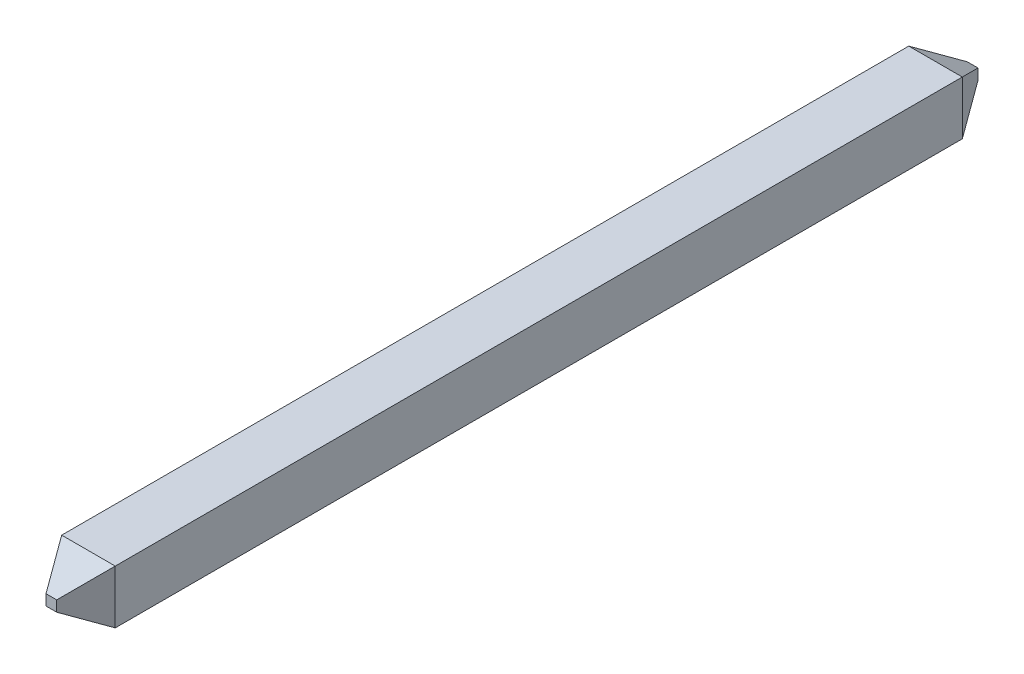
ISO-10303-21;
HEADER;
FILE_DESCRIPTION(('STEP AP214'),'2;1');
FILE_NAME('part.step','',(''),(''),'','','');
FILE_SCHEMA(('AUTOMOTIVE_DESIGN { 1 0 10303 214 1 1 1 1 }'));
ENDSEC;
DATA;
#1=APPLICATION_CONTEXT('core data for automotive mechanical design processes');
#2=APPLICATION_PROTOCOL_DEFINITION('international standard','automotive_design',2000,#1);
#3=PRODUCT_CONTEXT('',#1,'mechanical');
#4=PRODUCT('Part','Part','',(#3));
#5=PRODUCT_RELATED_PRODUCT_CATEGORY('part','',(#4));
#6=PRODUCT_DEFINITION_FORMATION('','',#4);
#7=PRODUCT_DEFINITION_CONTEXT('part definition',#1,'design');
#8=PRODUCT_DEFINITION('design','',#6,#7);
#9=PRODUCT_DEFINITION_SHAPE('','',#8);
#10=(LENGTH_UNIT() NAMED_UNIT(*) SI_UNIT(.MILLI.,.METRE.));
#11=(NAMED_UNIT(*) PLANE_ANGLE_UNIT() SI_UNIT($,.RADIAN.));
#12=(NAMED_UNIT(*) SI_UNIT($,.STERADIAN.) SOLID_ANGLE_UNIT());
#13=UNCERTAINTY_MEASURE_WITH_UNIT(LENGTH_MEASURE(1.E-05),#10,'distance_accuracy_value','');
#14=(GEOMETRIC_REPRESENTATION_CONTEXT(3) GLOBAL_UNCERTAINTY_ASSIGNED_CONTEXT((#13)) GLOBAL_UNIT_ASSIGNED_CONTEXT((#10,
#11,#12)) REPRESENTATION_CONTEXT('',''));
#15=CARTESIAN_POINT('',(0.,0.,0.));
#16=DIRECTION('',(0.,0.,1.));
#17=DIRECTION('',(1.,0.,0.));
#18=AXIS2_PLACEMENT_3D('',#15,#16,#17);
#19=CARTESIAN_POINT('',(0.3175,-0.3175,10.922));
#20=DIRECTION('',(-1.,0.,0.));
#21=DIRECTION('',(0.,0.,1.));
#22=AXIS2_PLACEMENT_3D('',#19,#20,#21);
#23=PLANE('',#22);
#24=DIRECTION('',(0.,0.,-1.));
#25=VECTOR('',#24,1.);
#26=CARTESIAN_POINT('',(0.3175,-0.3175,10.922));
#27=LINE('',#26,#25);
#28=CARTESIAN_POINT('',(0.3175,-0.3175,10.4820590948775));
#29=VERTEX_POINT('',#28);
#30=CARTESIAN_POINT('',(0.3175,-0.3175,0.439940905122496));
#31=VERTEX_POINT('',#30);
#32=EDGE_CURVE('E142',#29,#31,#27,.T.);
#33=ORIENTED_EDGE('',*,*,#32,.T.);
#34=DIRECTION('',(0.,1.,0.));
#35=VECTOR('',#34,1.);
#36=CARTESIAN_POINT('',(0.3175,0.3175,0.439940905122496));
#37=LINE('',#36,#35);
#38=CARTESIAN_POINT('',(0.3175,0.3175,0.439940905122496));
#39=VERTEX_POINT('',#38);
#40=EDGE_CURVE('E11',#31,#39,#37,.T.);
#41=ORIENTED_EDGE('',*,*,#40,.T.);
#42=DIRECTION('',(0.,0.,-1.));
#43=VECTOR('',#42,1.);
#44=CARTESIAN_POINT('',(0.3175,0.3175,10.922));
#45=LINE('',#44,#43);
#46=CARTESIAN_POINT('',(0.3175,0.3175,10.4820590948775));
#47=VERTEX_POINT('',#46);
#48=EDGE_CURVE('E119',#47,#39,#45,.T.);
#49=ORIENTED_EDGE('',*,*,#48,.F.);
#50=DIRECTION('',(0.,-1.,0.));
#51=VECTOR('',#50,1.);
#52=CARTESIAN_POINT('',(0.3175,-0.3175,10.4820590948775));
#53=LINE('',#52,#51);
#54=EDGE_CURVE('E132',#47,#29,#53,.T.);
#55=ORIENTED_EDGE('',*,*,#54,.T.);
#56=EDGE_LOOP('',(#33,#41,#49,#55));
#57=FACE_BOUND('',#56,.T.);
#58=ADVANCED_FACE('F32',(#57),#23,.F.);
#59=CARTESIAN_POINT('',(-0.3175,0.3175,10.922));
#60=DIRECTION('',(0.,-1.,0.));
#61=DIRECTION('',(0.,0.,-1.));
#62=AXIS2_PLACEMENT_3D('',#59,#60,#61);
#63=PLANE('',#62);
#64=ORIENTED_EDGE('',*,*,#48,.T.);
#65=DIRECTION('',(-1.,0.,0.));
#66=VECTOR('',#65,1.);
#67=CARTESIAN_POINT('',(-0.3175,0.3175,0.439940905122496));
#68=LINE('',#67,#66);
#69=CARTESIAN_POINT('',(-0.3175,0.3175,0.439940905122496));
#70=VERTEX_POINT('',#69);
#71=EDGE_CURVE('E41',#39,#70,#68,.T.);
#72=ORIENTED_EDGE('',*,*,#71,.T.);
#73=DIRECTION('',(0.,0.,-1.));
#74=VECTOR('',#73,1.);
#75=CARTESIAN_POINT('',(-0.3175,0.3175,10.922));
#76=LINE('',#75,#74);
#77=CARTESIAN_POINT('',(-0.3175,0.3175,10.4820590948775));
#78=VERTEX_POINT('',#77);
#79=EDGE_CURVE('E190',#78,#70,#76,.T.);
#80=ORIENTED_EDGE('',*,*,#79,.F.);
#81=DIRECTION('',(1.,0.,0.));
#82=VECTOR('',#81,1.);
#83=CARTESIAN_POINT('',(-0.3175,0.3175,10.4820590948775));
#84=LINE('',#83,#82);
#85=EDGE_CURVE('E126',#78,#47,#84,.T.);
#86=ORIENTED_EDGE('',*,*,#85,.T.);
#87=EDGE_LOOP('',(#64,#72,#80,#86));
#88=FACE_BOUND('',#87,.T.);
#89=ADVANCED_FACE('F202',(#88),#63,.F.);
#90=CARTESIAN_POINT('',(-0.3175,-0.3175,10.922));
#91=DIRECTION('',(1.,0.,0.));
#92=DIRECTION('',(0.,0.,-1.));
#93=AXIS2_PLACEMENT_3D('',#90,#91,#92);
#94=PLANE('',#93);
#95=ORIENTED_EDGE('',*,*,#79,.T.);
#96=DIRECTION('',(0.,-1.,0.));
#97=VECTOR('',#96,1.);
#98=CARTESIAN_POINT('',(-0.3175,-0.3175,0.439940905122496));
#99=LINE('',#98,#97);
#100=CARTESIAN_POINT('',(-0.3175,-0.3175,0.439940905122496));
#101=VERTEX_POINT('',#100);
#102=EDGE_CURVE('E154',#70,#101,#99,.T.);
#103=ORIENTED_EDGE('',*,*,#102,.T.);
#104=DIRECTION('',(0.,0.,-1.));
#105=VECTOR('',#104,1.);
#106=CARTESIAN_POINT('',(-0.3175,-0.3175,10.922));
#107=LINE('',#106,#105);
#108=CARTESIAN_POINT('',(-0.3175,-0.3175,10.4820590948775));
#109=VERTEX_POINT('',#108);
#110=EDGE_CURVE('E187',#109,#101,#107,.T.);
#111=ORIENTED_EDGE('',*,*,#110,.F.);
#112=DIRECTION('',(0.,1.,0.));
#113=VECTOR('',#112,1.);
#114=CARTESIAN_POINT('',(-0.3175,-0.3175,10.4820590948775));
#115=LINE('',#114,#113);
#116=EDGE_CURVE('E106',#109,#78,#115,.T.);
#117=ORIENTED_EDGE('',*,*,#116,.T.);
#118=EDGE_LOOP('',(#95,#103,#111,#117));
#119=FACE_BOUND('',#118,.T.);
#120=ADVANCED_FACE('F201',(#119),#94,.F.);
#121=CARTESIAN_POINT('',(-0.3175,-0.3175,10.922));
#122=DIRECTION('',(0.,1.,0.));
#123=DIRECTION('',(0.,0.,1.));
#124=AXIS2_PLACEMENT_3D('',#121,#122,#123);
#125=PLANE('',#124);
#126=ORIENTED_EDGE('',*,*,#110,.T.);
#127=DIRECTION('',(1.,0.,0.));
#128=VECTOR('',#127,1.);
#129=CARTESIAN_POINT('',(0.3175,-0.3175,0.439940905122496));
#130=LINE('',#129,#128);
#131=EDGE_CURVE('E135',#101,#31,#130,.T.);
#132=ORIENTED_EDGE('',*,*,#131,.T.);
#133=ORIENTED_EDGE('',*,*,#32,.F.);
#134=DIRECTION('',(-1.,0.,0.));
#135=VECTOR('',#134,1.);
#136=CARTESIAN_POINT('',(-0.3175,-0.3175,10.4820590948775));
#137=LINE('',#136,#135);
#138=EDGE_CURVE('E134',#29,#109,#137,.T.);
#139=ORIENTED_EDGE('',*,*,#138,.T.);
#140=EDGE_LOOP('',(#126,#132,#133,#139));
#141=FACE_BOUND('',#140,.T.);
#142=ADVANCED_FACE('F185',(#141),#125,.F.);
#143=CARTESIAN_POINT('',(0.,0.,10.922));
#144=DIRECTION('',(0.,0.,-1.));
#145=DIRECTION('',(-1.,0.,0.));
#146=AXIS2_PLACEMENT_3D('',#143,#144,#145);
#147=PLANE('',#146);
#148=DIRECTION('',(-1.,0.,0.));
#149=VECTOR('',#148,1.);
#150=CARTESIAN_POINT('',(0.,0.0634999999999993,10.922));
#151=LINE('',#150,#149);
#152=CARTESIAN_POINT('',(0.0634999999999993,0.0634999999999993,10.922));
#153=VERTEX_POINT('',#152);
#154=CARTESIAN_POINT('',(-0.0634999999999993,0.0634999999999993,10.922));
#155=VERTEX_POINT('',#154);
#156=EDGE_CURVE('E123',#153,#155,#151,.T.);
#157=ORIENTED_EDGE('',*,*,#156,.T.);
#158=DIRECTION('',(0.,-1.,0.));
#159=VECTOR('',#158,1.);
#160=CARTESIAN_POINT('',(-0.0634999999999993,0.,10.922));
#161=LINE('',#160,#159);
#162=CARTESIAN_POINT('',(-0.0634999999999993,-0.0634999999999993,10.922));
#163=VERTEX_POINT('',#162);
#164=EDGE_CURVE('E104',#155,#163,#161,.T.);
#165=ORIENTED_EDGE('',*,*,#164,.T.);
#166=DIRECTION('',(1.,0.,0.));
#167=VECTOR('',#166,1.);
#168=CARTESIAN_POINT('',(0.,-0.0634999999999993,10.922));
#169=LINE('',#168,#167);
#170=CARTESIAN_POINT('',(0.0634999999999993,-0.0634999999999993,10.922));
#171=VERTEX_POINT('',#170);
#172=EDGE_CURVE('E112',#163,#171,#169,.T.);
#173=ORIENTED_EDGE('',*,*,#172,.T.);
#174=DIRECTION('',(0.,1.,0.));
#175=VECTOR('',#174,1.);
#176=CARTESIAN_POINT('',(0.0634999999999993,0.,10.922));
#177=LINE('',#176,#175);
#178=EDGE_CURVE('E118',#171,#153,#177,.T.);
#179=ORIENTED_EDGE('',*,*,#178,.T.);
#180=EDGE_LOOP('',(#157,#165,#173,#179));
#181=FACE_BOUND('',#180,.T.);
#182=ADVANCED_FACE('F121',(#181),#147,.F.);
#183=CARTESIAN_POINT('',(0.,0.,0.));
#184=DIRECTION('',(0.,0.,-1.));
#185=DIRECTION('',(-1.,0.,0.));
#186=AXIS2_PLACEMENT_3D('',#183,#184,#185);
#187=PLANE('',#186);
#188=DIRECTION('',(0.,-1.,0.));
#189=VECTOR('',#188,1.);
#190=CARTESIAN_POINT('',(0.0634999999999993,-0.3175,0.));
#191=LINE('',#190,#189);
#192=CARTESIAN_POINT('',(0.0634999999999993,0.0634999999999993,0.));
#193=VERTEX_POINT('',#192);
#194=CARTESIAN_POINT('',(0.0634999999999993,-0.0634999999999993,0.));
#195=VERTEX_POINT('',#194);
#196=EDGE_CURVE('E145',#193,#195,#191,.T.);
#197=ORIENTED_EDGE('',*,*,#196,.T.);
#198=DIRECTION('',(-1.,0.,0.));
#199=VECTOR('',#198,1.);
#200=CARTESIAN_POINT('',(-0.3175,-0.0634999999999993,0.));
#201=LINE('',#200,#199);
#202=CARTESIAN_POINT('',(-0.0634999999999993,-0.0634999999999993,0.));
#203=VERTEX_POINT('',#202);
#204=EDGE_CURVE('E151',#195,#203,#201,.T.);
#205=ORIENTED_EDGE('',*,*,#204,.T.);
#206=DIRECTION('',(0.,1.,0.));
#207=VECTOR('',#206,1.);
#208=CARTESIAN_POINT('',(-0.0634999999999993,0.3175,0.));
#209=LINE('',#208,#207);
#210=CARTESIAN_POINT('',(-0.0634999999999993,0.0634999999999993,0.));
#211=VERTEX_POINT('',#210);
#212=EDGE_CURVE('E149',#203,#211,#209,.T.);
#213=ORIENTED_EDGE('',*,*,#212,.T.);
#214=DIRECTION('',(1.,0.,0.));
#215=VECTOR('',#214,1.);
#216=CARTESIAN_POINT('',(0.3175,0.0634999999999993,0.));
#217=LINE('',#216,#215);
#218=EDGE_CURVE('E147',#211,#193,#217,.T.);
#219=ORIENTED_EDGE('',*,*,#218,.T.);
#220=EDGE_LOOP('',(#197,#205,#213,#219));
#221=FACE_BOUND('',#220,.T.);
#222=ADVANCED_FACE('F175',(#221),#187,.T.);
#223=CARTESIAN_POINT('',(0.0634999999999993,0.,10.922));
#224=DIRECTION('',(-0.866025403784437,0.,-0.500000000000003));
#225=DIRECTION('',(0.,1.,0.));
#226=AXIS2_PLACEMENT_3D('',#223,#224,#225);
#227=PLANE('',#226);
#228=DIRECTION('',(-0.44721359549996,0.44721359549996,0.774596669241481));
#229=VECTOR('',#228,1.);
#230=CARTESIAN_POINT('',(0.0507999999999993,-0.0507999999999993,10.9439970452561));
#231=LINE('',#230,#229);
#232=EDGE_CURVE('E115',#29,#171,#231,.T.);
#233=ORIENTED_EDGE('',*,*,#232,.F.);
#234=ORIENTED_EDGE('',*,*,#54,.F.);
#235=DIRECTION('',(-0.44721359549996,-0.44721359549996,0.774596669241481));
#236=VECTOR('',#235,1.);
#237=CARTESIAN_POINT('',(0.0507999999999993,0.0507999999999993,10.9439970452561));
#238=LINE('',#237,#236);
#239=EDGE_CURVE('E139',#153,#47,#238,.F.);
#240=ORIENTED_EDGE('',*,*,#239,.F.);
#241=ORIENTED_EDGE('',*,*,#178,.F.);
#242=EDGE_LOOP('',(#233,#234,#240,#241));
#243=FACE_BOUND('',#242,.T.);
#244=ADVANCED_FACE('F196',(#243),#227,.F.);
#245=CARTESIAN_POINT('',(0.,0.0634999999999993,10.922));
#246=DIRECTION('',(0.,-0.866025403784437,-0.500000000000003));
#247=DIRECTION('',(-1.,0.,0.));
#248=AXIS2_PLACEMENT_3D('',#245,#246,#247);
#249=PLANE('',#248);
#250=ORIENTED_EDGE('',*,*,#239,.T.);
#251=ORIENTED_EDGE('',*,*,#85,.F.);
#252=DIRECTION('',(0.44721359549996,-0.44721359549996,0.774596669241481));
#253=VECTOR('',#252,1.);
#254=CARTESIAN_POINT('',(-0.0507999999999993,0.0507999999999993,10.9439970452561));
#255=LINE('',#254,#253);
#256=EDGE_CURVE('E109',#155,#78,#255,.F.);
#257=ORIENTED_EDGE('',*,*,#256,.F.);
#258=ORIENTED_EDGE('',*,*,#156,.F.);
#259=EDGE_LOOP('',(#250,#251,#257,#258));
#260=FACE_BOUND('',#259,.T.);
#261=ADVANCED_FACE('F199',(#260),#249,.F.);
#262=CARTESIAN_POINT('',(0.,-0.0634999999999993,10.922));
#263=DIRECTION('',(0.,0.866025403784437,-0.500000000000003));
#264=DIRECTION('',(1.,0.,0.));
#265=AXIS2_PLACEMENT_3D('',#262,#263,#264);
#266=PLANE('',#265);
#267=ORIENTED_EDGE('',*,*,#232,.T.);
#268=ORIENTED_EDGE('',*,*,#172,.F.);
#269=DIRECTION('',(-0.44721359549996,-0.44721359549996,-0.774596669241481));
#270=VECTOR('',#269,1.);
#271=CARTESIAN_POINT('',(-0.0507999999999993,-0.0507999999999993,10.9439970452561));
#272=LINE('',#271,#270);
#273=EDGE_CURVE('E100',#109,#163,#272,.F.);
#274=ORIENTED_EDGE('',*,*,#273,.F.);
#275=ORIENTED_EDGE('',*,*,#138,.F.);
#276=EDGE_LOOP('',(#267,#268,#274,#275));
#277=FACE_BOUND('',#276,.T.);
#278=ADVANCED_FACE('F113',(#277),#266,.F.);
#279=CARTESIAN_POINT('',(-0.0634999999999993,0.,10.922));
#280=DIRECTION('',(0.866025403784437,0.,-0.500000000000003));
#281=DIRECTION('',(0.,-1.,0.));
#282=AXIS2_PLACEMENT_3D('',#279,#280,#281);
#283=PLANE('',#282);
#284=ORIENTED_EDGE('',*,*,#256,.T.);
#285=ORIENTED_EDGE('',*,*,#116,.F.);
#286=ORIENTED_EDGE('',*,*,#273,.T.);
#287=ORIENTED_EDGE('',*,*,#164,.F.);
#288=EDGE_LOOP('',(#284,#285,#286,#287));
#289=FACE_BOUND('',#288,.T.);
#290=ADVANCED_FACE('F102',(#289),#283,.F.);
#291=CARTESIAN_POINT('',(-0.3175,0.3175,0.439940905122496));
#292=DIRECTION('',(0.,0.866025403784439,-0.5));
#293=DIRECTION('',(1.,0.,0.));
#294=AXIS2_PLACEMENT_3D('',#291,#292,#293);
#295=PLANE('',#294);
#296=DIRECTION('',(0.447213595499958,0.447213595499958,0.774596669241483));
#297=VECTOR('',#296,1.);
#298=CARTESIAN_POINT('',(0.1905,0.1905,0.219970452561248));
#299=LINE('',#298,#297);
#300=EDGE_CURVE('E160',#193,#39,#299,.T.);
#301=ORIENTED_EDGE('',*,*,#300,.F.);
#302=ORIENTED_EDGE('',*,*,#218,.F.);
#303=DIRECTION('',(-0.447213595499958,0.447213595499958,0.774596669241483));
#304=VECTOR('',#303,1.);
#305=CARTESIAN_POINT('',(-0.3175,0.3175,0.439940905122496));
#306=LINE('',#305,#304);
#307=EDGE_CURVE('E36',#70,#211,#306,.F.);
#308=ORIENTED_EDGE('',*,*,#307,.F.);
#309=ORIENTED_EDGE('',*,*,#71,.F.);
#310=EDGE_LOOP('',(#301,#302,#308,#309));
#311=FACE_BOUND('',#310,.T.);
#312=ADVANCED_FACE('F34',(#311),#295,.T.);
#313=CARTESIAN_POINT('',(-0.3175,-0.3175,0.439940905122496));
#314=DIRECTION('',(-0.866025403784439,0.,-0.5));
#315=DIRECTION('',(0.,1.,0.));
#316=AXIS2_PLACEMENT_3D('',#313,#314,#315);
#317=PLANE('',#316);
#318=ORIENTED_EDGE('',*,*,#307,.T.);
#319=ORIENTED_EDGE('',*,*,#212,.F.);
#320=DIRECTION('',(-0.447213595499958,-0.447213595499958,0.774596669241483));
#321=VECTOR('',#320,1.);
#322=CARTESIAN_POINT('',(-0.3175,-0.3175,0.439940905122496));
#323=LINE('',#322,#321);
#324=EDGE_CURVE('E159',#101,#203,#323,.F.);
#325=ORIENTED_EDGE('',*,*,#324,.F.);
#326=ORIENTED_EDGE('',*,*,#102,.F.);
#327=EDGE_LOOP('',(#318,#319,#325,#326));
#328=FACE_BOUND('',#327,.T.);
#329=ADVANCED_FACE('F170',(#328),#317,.T.);
#330=CARTESIAN_POINT('',(0.3175,-0.3175,0.439940905122496));
#331=DIRECTION('',(0.866025403784439,0.,-0.5));
#332=DIRECTION('',(0.,-1.,0.));
#333=AXIS2_PLACEMENT_3D('',#330,#331,#332);
#334=PLANE('',#333);
#335=ORIENTED_EDGE('',*,*,#300,.T.);
#336=ORIENTED_EDGE('',*,*,#40,.F.);
#337=DIRECTION('',(-0.447213595499958,0.447213595499958,-0.774596669241483));
#338=VECTOR('',#337,1.);
#339=CARTESIAN_POINT('',(0.3175,-0.3175,0.439940905122496));
#340=LINE('',#339,#338);
#341=EDGE_CURVE('E157',#195,#31,#340,.F.);
#342=ORIENTED_EDGE('',*,*,#341,.F.);
#343=ORIENTED_EDGE('',*,*,#196,.F.);
#344=EDGE_LOOP('',(#335,#336,#342,#343));
#345=FACE_BOUND('',#344,.T.);
#346=ADVANCED_FACE('F181',(#345),#334,.T.);
#347=CARTESIAN_POINT('',(-0.3175,-0.3175,0.439940905122496));
#348=DIRECTION('',(0.,-0.866025403784439,-0.5));
#349=DIRECTION('',(-1.,0.,0.));
#350=AXIS2_PLACEMENT_3D('',#347,#348,#349);
#351=PLANE('',#350);
#352=ORIENTED_EDGE('',*,*,#324,.T.);
#353=ORIENTED_EDGE('',*,*,#204,.F.);
#354=ORIENTED_EDGE('',*,*,#341,.T.);
#355=ORIENTED_EDGE('',*,*,#131,.F.);
#356=EDGE_LOOP('',(#352,#353,#354,#355));
#357=FACE_BOUND('',#356,.T.);
#358=ADVANCED_FACE('F179',(#357),#351,.T.);
#359=CLOSED_SHELL('',(#58,#89,#120,#142,#182,#222,#244,#261,#278,#290,#312,#329,#346,#358));
#360=MANIFOLD_SOLID_BREP('B2',#359);
#361=ADVANCED_BREP_SHAPE_REPRESENTATION('',(#18,#360),#14);
#362=SHAPE_DEFINITION_REPRESENTATION(#9,#361);
ENDSEC;
END-ISO-10303-21;
